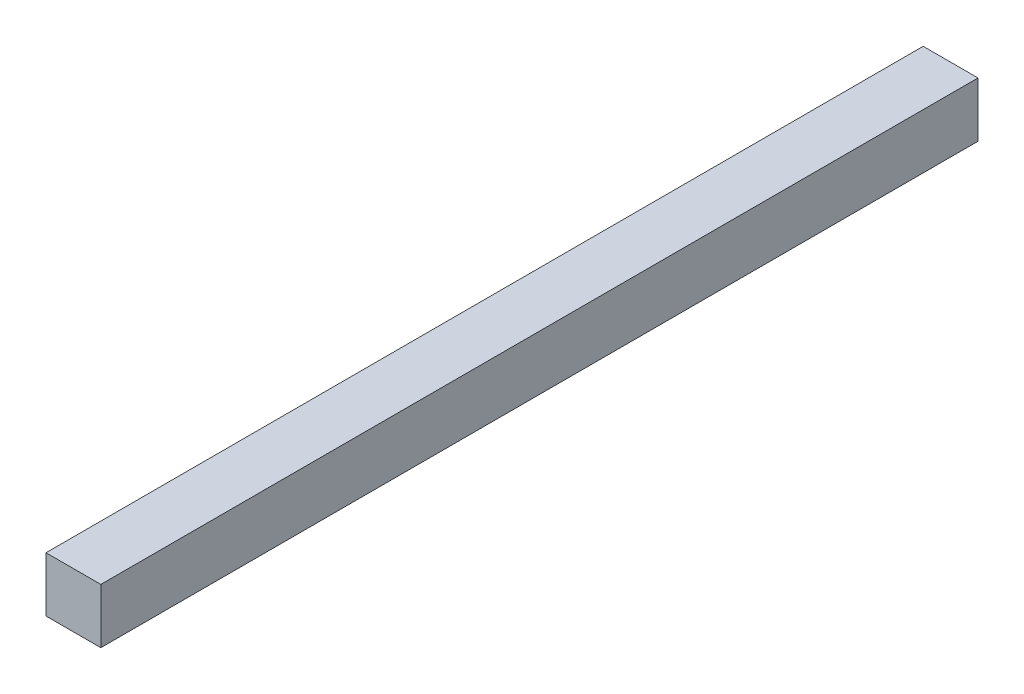
ISO-10303-21;
HEADER;
FILE_DESCRIPTION(('STEP AP214'),'2;1');
FILE_NAME('part.step','',(''),(''),'','','');
FILE_SCHEMA(('AUTOMOTIVE_DESIGN { 1 0 10303 214 1 1 1 1 }'));
ENDSEC;
DATA;
#1=APPLICATION_CONTEXT('core data for automotive mechanical design processes');
#2=APPLICATION_PROTOCOL_DEFINITION('international standard','automotive_design',2000,#1);
#3=PRODUCT_CONTEXT('',#1,'mechanical');
#4=PRODUCT('Part','Part','',(#3));
#5=PRODUCT_RELATED_PRODUCT_CATEGORY('part','',(#4));
#6=PRODUCT_DEFINITION_FORMATION('','',#4);
#7=PRODUCT_DEFINITION_CONTEXT('part definition',#1,'design');
#8=PRODUCT_DEFINITION('design','',#6,#7);
#9=PRODUCT_DEFINITION_SHAPE('','',#8);
#10=(LENGTH_UNIT() NAMED_UNIT(*) SI_UNIT(.MILLI.,.METRE.));
#11=(NAMED_UNIT(*) PLANE_ANGLE_UNIT() SI_UNIT($,.RADIAN.));
#12=(NAMED_UNIT(*) SI_UNIT($,.STERADIAN.) SOLID_ANGLE_UNIT());
#13=UNCERTAINTY_MEASURE_WITH_UNIT(LENGTH_MEASURE(1.E-05),#10,'distance_accuracy_value','');
#14=(GEOMETRIC_REPRESENTATION_CONTEXT(3) GLOBAL_UNCERTAINTY_ASSIGNED_CONTEXT((#13)) GLOBAL_UNIT_ASSIGNED_CONTEXT((#10,
#11,#12)) REPRESENTATION_CONTEXT('',''));
#15=CARTESIAN_POINT('',(0.,0.,0.));
#16=DIRECTION('',(0.,0.,1.));
#17=DIRECTION('',(1.,0.,0.));
#18=AXIS2_PLACEMENT_3D('',#15,#16,#17);
#19=CARTESIAN_POINT('',(0.,0.,800.));
#20=DIRECTION('',(-1.,0.,0.));
#21=DIRECTION('',(0.,-1.,0.));
#22=AXIS2_PLACEMENT_3D('',#19,#20,#21);
#23=PLANE('',#22);
#24=DIRECTION('',(0.,1.,0.));
#25=VECTOR('',#24,1.);
#26=CARTESIAN_POINT('',(0.,0.,0.));
#27=LINE('',#26,#25);
#28=CARTESIAN_POINT('',(0.,0.,0.));
#29=VERTEX_POINT('',#28);
#30=CARTESIAN_POINT('',(0.,50.,0.));
#31=VERTEX_POINT('',#30);
#32=EDGE_CURVE('E110',#29,#31,#27,.T.);
#33=ORIENTED_EDGE('',*,*,#32,.F.);
#34=DIRECTION('',(0.,0.,-1.));
#35=VECTOR('',#34,1.);
#36=CARTESIAN_POINT('',(0.,0.,800.));
#37=LINE('',#36,#35);
#38=CARTESIAN_POINT('',(0.,0.,800.));
#39=VERTEX_POINT('',#38);
#40=EDGE_CURVE('E11',#39,#29,#37,.T.);
#41=ORIENTED_EDGE('',*,*,#40,.F.);
#42=DIRECTION('',(0.,1.,0.));
#43=VECTOR('',#42,1.);
#44=CARTESIAN_POINT('',(0.,0.,800.));
#45=LINE('',#44,#43);
#46=CARTESIAN_POINT('',(0.,50.,800.));
#47=VERTEX_POINT('',#46);
#48=EDGE_CURVE('E103',#39,#47,#45,.T.);
#49=ORIENTED_EDGE('',*,*,#48,.T.);
#50=DIRECTION('',(0.,0.,-1.));
#51=VECTOR('',#50,1.);
#52=CARTESIAN_POINT('',(0.,50.,800.));
#53=LINE('',#52,#51);
#54=EDGE_CURVE('E42',#47,#31,#53,.T.);
#55=ORIENTED_EDGE('',*,*,#54,.T.);
#56=EDGE_LOOP('',(#33,#41,#49,#55));
#57=FACE_BOUND('',#56,.T.);
#58=ADVANCED_FACE('F39',(#57),#23,.T.);
#59=CARTESIAN_POINT('',(0.,0.,800.));
#60=DIRECTION('',(0.,1.,0.));
#61=DIRECTION('',(0.,0.,1.));
#62=AXIS2_PLACEMENT_3D('',#59,#60,#61);
#63=PLANE('',#62);
#64=DIRECTION('',(1.,0.,0.));
#65=VECTOR('',#64,1.);
#66=CARTESIAN_POINT('',(0.,0.,0.));
#67=LINE('',#66,#65);
#68=CARTESIAN_POINT('',(50.,0.,0.));
#69=VERTEX_POINT('',#68);
#70=EDGE_CURVE('E73',#29,#69,#67,.T.);
#71=ORIENTED_EDGE('',*,*,#70,.T.);
#72=DIRECTION('',(0.,0.,-1.));
#73=VECTOR('',#72,1.);
#74=CARTESIAN_POINT('',(50.,0.,800.));
#75=LINE('',#74,#73);
#76=CARTESIAN_POINT('',(50.,0.,800.));
#77=VERTEX_POINT('',#76);
#78=EDGE_CURVE('E49',#77,#69,#75,.T.);
#79=ORIENTED_EDGE('',*,*,#78,.F.);
#80=DIRECTION('',(1.,0.,0.));
#81=VECTOR('',#80,1.);
#82=CARTESIAN_POINT('',(0.,0.,800.));
#83=LINE('',#82,#81);
#84=EDGE_CURVE('E90',#39,#77,#83,.T.);
#85=ORIENTED_EDGE('',*,*,#84,.F.);
#86=ORIENTED_EDGE('',*,*,#40,.T.);
#87=EDGE_LOOP('',(#71,#79,#85,#86));
#88=FACE_BOUND('',#87,.T.);
#89=ADVANCED_FACE('F126',(#88),#63,.F.);
#90=CARTESIAN_POINT('',(50.,0.,800.));
#91=DIRECTION('',(-1.,0.,0.));
#92=DIRECTION('',(0.,-1.,0.));
#93=AXIS2_PLACEMENT_3D('',#90,#91,#92);
#94=PLANE('',#93);
#95=DIRECTION('',(0.,1.,0.));
#96=VECTOR('',#95,1.);
#97=CARTESIAN_POINT('',(50.,0.,0.));
#98=LINE('',#97,#96);
#99=CARTESIAN_POINT('',(50.,50.,0.));
#100=VERTEX_POINT('',#99);
#101=EDGE_CURVE('E98',#69,#100,#98,.T.);
#102=ORIENTED_EDGE('',*,*,#101,.T.);
#103=DIRECTION('',(0.,0.,-1.));
#104=VECTOR('',#103,1.);
#105=CARTESIAN_POINT('',(50.,50.,800.));
#106=LINE('',#105,#104);
#107=CARTESIAN_POINT('',(50.,50.,800.));
#108=VERTEX_POINT('',#107);
#109=EDGE_CURVE('E95',#108,#100,#106,.T.);
#110=ORIENTED_EDGE('',*,*,#109,.F.);
#111=DIRECTION('',(0.,1.,0.));
#112=VECTOR('',#111,1.);
#113=CARTESIAN_POINT('',(50.,0.,800.));
#114=LINE('',#113,#112);
#115=EDGE_CURVE('E85',#77,#108,#114,.T.);
#116=ORIENTED_EDGE('',*,*,#115,.F.);
#117=ORIENTED_EDGE('',*,*,#78,.T.);
#118=EDGE_LOOP('',(#102,#110,#116,#117));
#119=FACE_BOUND('',#118,.T.);
#120=ADVANCED_FACE('F96',(#119),#94,.F.);
#121=CARTESIAN_POINT('',(0.,50.,800.));
#122=DIRECTION('',(0.,1.,0.));
#123=DIRECTION('',(0.,0.,1.));
#124=AXIS2_PLACEMENT_3D('',#121,#122,#123);
#125=PLANE('',#124);
#126=DIRECTION('',(1.,0.,0.));
#127=VECTOR('',#126,1.);
#128=CARTESIAN_POINT('',(0.,50.,0.));
#129=LINE('',#128,#127);
#130=EDGE_CURVE('E114',#31,#100,#129,.T.);
#131=ORIENTED_EDGE('',*,*,#130,.F.);
#132=ORIENTED_EDGE('',*,*,#54,.F.);
#133=DIRECTION('',(1.,0.,0.));
#134=VECTOR('',#133,1.);
#135=CARTESIAN_POINT('',(0.,50.,800.));
#136=LINE('',#135,#134);
#137=EDGE_CURVE('E89',#47,#108,#136,.T.);
#138=ORIENTED_EDGE('',*,*,#137,.T.);
#139=ORIENTED_EDGE('',*,*,#109,.T.);
#140=EDGE_LOOP('',(#131,#132,#138,#139));
#141=FACE_BOUND('',#140,.T.);
#142=ADVANCED_FACE('F101',(#141),#125,.T.);
#143=CARTESIAN_POINT('',(0.,0.,800.));
#144=DIRECTION('',(0.,0.,-1.));
#145=DIRECTION('',(-1.,0.,0.));
#146=AXIS2_PLACEMENT_3D('',#143,#144,#145);
#147=PLANE('',#146);
#148=ORIENTED_EDGE('',*,*,#48,.F.);
#149=ORIENTED_EDGE('',*,*,#84,.T.);
#150=ORIENTED_EDGE('',*,*,#115,.T.);
#151=ORIENTED_EDGE('',*,*,#137,.F.);
#152=EDGE_LOOP('',(#148,#149,#150,#151));
#153=FACE_BOUND('',#152,.T.);
#154=ADVANCED_FACE('F88',(#153),#147,.F.);
#155=CARTESIAN_POINT('',(0.,0.,0.));
#156=DIRECTION('',(0.,0.,-1.));
#157=DIRECTION('',(-1.,0.,0.));
#158=AXIS2_PLACEMENT_3D('',#155,#156,#157);
#159=PLANE('',#158);
#160=ORIENTED_EDGE('',*,*,#32,.T.);
#161=ORIENTED_EDGE('',*,*,#130,.T.);
#162=ORIENTED_EDGE('',*,*,#101,.F.);
#163=ORIENTED_EDGE('',*,*,#70,.F.);
#164=EDGE_LOOP('',(#160,#161,#162,#163));
#165=FACE_BOUND('',#164,.T.);
#166=ADVANCED_FACE('F123',(#165),#159,.T.);
#167=CLOSED_SHELL('',(#58,#89,#120,#142,#154,#166));
#168=MANIFOLD_SOLID_BREP('B2',#167);
#169=ADVANCED_BREP_SHAPE_REPRESENTATION('',(#18,#168),#14);
#170=SHAPE_DEFINITION_REPRESENTATION(#9,#169);
ENDSEC;
END-ISO-10303-21;
